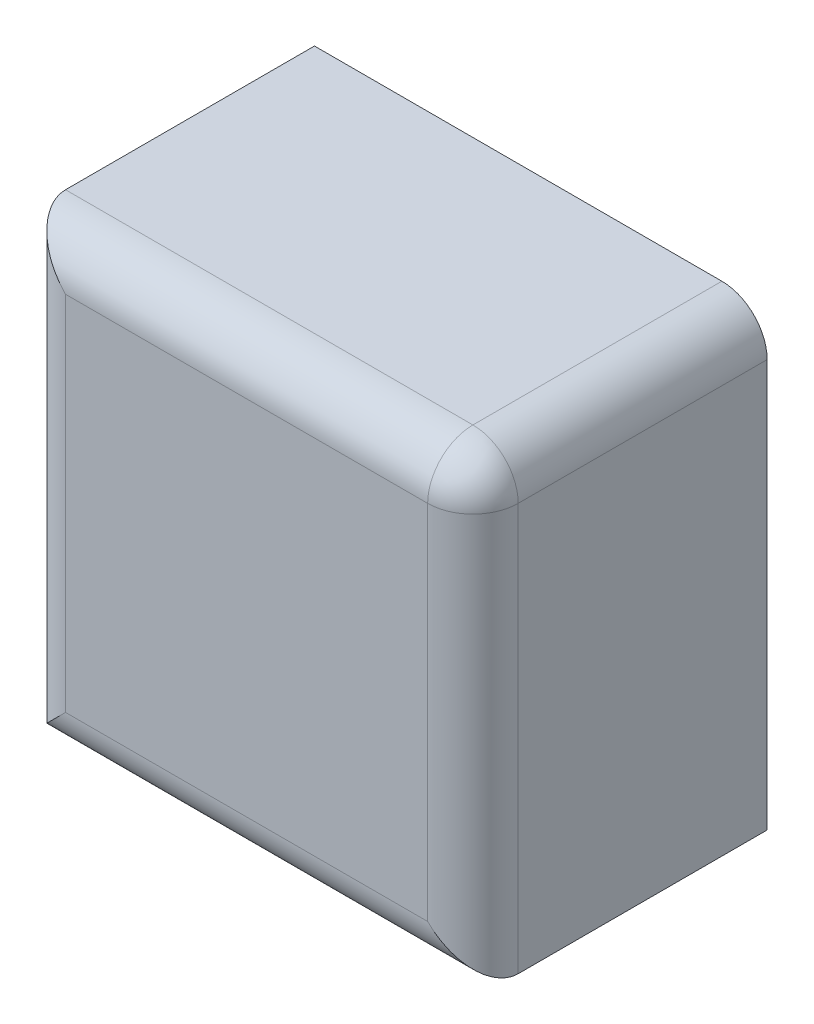
ISO-10303-21;
HEADER;
FILE_DESCRIPTION(('STEP AP214'),'2;1');
FILE_NAME('part.step','',(''),(''),'','','');
FILE_SCHEMA(('AUTOMOTIVE_DESIGN { 1 0 10303 214 1 1 1 1 }'));
ENDSEC;
DATA;
#1=APPLICATION_CONTEXT('core data for automotive mechanical design processes');
#2=APPLICATION_PROTOCOL_DEFINITION('international standard','automotive_design',2000,#1);
#3=PRODUCT_CONTEXT('',#1,'mechanical');
#4=PRODUCT('Part','Part','',(#3));
#5=PRODUCT_RELATED_PRODUCT_CATEGORY('part','',(#4));
#6=PRODUCT_DEFINITION_FORMATION('','',#4);
#7=PRODUCT_DEFINITION_CONTEXT('part definition',#1,'design');
#8=PRODUCT_DEFINITION('design','',#6,#7);
#9=PRODUCT_DEFINITION_SHAPE('','',#8);
#10=(LENGTH_UNIT() NAMED_UNIT(*) SI_UNIT(.MILLI.,.METRE.));
#11=(NAMED_UNIT(*) PLANE_ANGLE_UNIT() SI_UNIT($,.RADIAN.));
#12=(NAMED_UNIT(*) SI_UNIT($,.STERADIAN.) SOLID_ANGLE_UNIT());
#13=UNCERTAINTY_MEASURE_WITH_UNIT(LENGTH_MEASURE(1.E-05),#10,'distance_accuracy_value','');
#14=(GEOMETRIC_REPRESENTATION_CONTEXT(3) GLOBAL_UNCERTAINTY_ASSIGNED_CONTEXT((#13)) GLOBAL_UNIT_ASSIGNED_CONTEXT((#10,
#11,#12)) REPRESENTATION_CONTEXT('',''));
#15=CARTESIAN_POINT('',(0.,0.,0.));
#16=DIRECTION('',(0.,0.,1.));
#17=DIRECTION('',(1.,0.,0.));
#18=AXIS2_PLACEMENT_3D('',#15,#16,#17);
#19=CARTESIAN_POINT('',(0.,0.,6.5));
#20=DIRECTION('',(1.,0.,0.));
#21=DIRECTION('',(0.,0.,-1.));
#22=AXIS2_PLACEMENT_3D('',#19,#20,#21);
#23=PLANE('',#22);
#24=DIRECTION('',(0.,0.,-1.));
#25=VECTOR('',#24,1.);
#26=CARTESIAN_POINT('',(0.,0.,6.5));
#27=LINE('',#26,#25);
#28=CARTESIAN_POINT('',(0.,0.,5.5));
#29=VERTEX_POINT('',#28);
#30=CARTESIAN_POINT('',(0.,0.,0.));
#31=VERTEX_POINT('',#30);
#32=EDGE_CURVE('E128',#29,#31,#27,.T.);
#33=ORIENTED_EDGE('',*,*,#32,.F.);
#34=DIRECTION('',(0.,-1.,0.));
#35=VECTOR('',#34,1.);
#36=CARTESIAN_POINT('',(0.,0.,5.5));
#37=LINE('',#36,#35);
#38=CARTESIAN_POINT('',(0.,10.,5.5));
#39=VERTEX_POINT('',#38);
#40=EDGE_CURVE('E41',#29,#39,#37,.F.);
#41=ORIENTED_EDGE('',*,*,#40,.T.);
#42=DIRECTION('',(0.,0.,-1.));
#43=VECTOR('',#42,1.);
#44=CARTESIAN_POINT('',(0.,10.,6.5));
#45=LINE('',#44,#43);
#46=CARTESIAN_POINT('',(0.,10.,0.));
#47=VERTEX_POINT('',#46);
#48=EDGE_CURVE('E124',#39,#47,#45,.T.);
#49=ORIENTED_EDGE('',*,*,#48,.T.);
#50=DIRECTION('',(0.,-1.,0.));
#51=VECTOR('',#50,1.);
#52=CARTESIAN_POINT('',(0.,0.,0.));
#53=LINE('',#52,#51);
#54=EDGE_CURVE('E113',#47,#31,#53,.T.);
#55=ORIENTED_EDGE('',*,*,#54,.T.);
#56=EDGE_LOOP('',(#33,#41,#49,#55));
#57=FACE_BOUND('',#56,.T.);
#58=ADVANCED_FACE('F32',(#57),#23,.F.);
#59=CARTESIAN_POINT('',(0.,0.,6.5));
#60=DIRECTION('',(0.,1.,0.));
#61=DIRECTION('',(0.,0.,1.));
#62=AXIS2_PLACEMENT_3D('',#59,#60,#61);
#63=PLANE('',#62);
#64=DIRECTION('',(0.,0.,-1.));
#65=VECTOR('',#64,1.);
#66=CARTESIAN_POINT('',(10.,0.,6.5));
#67=LINE('',#66,#65);
#68=CARTESIAN_POINT('',(10.,0.,5.5));
#69=VERTEX_POINT('',#68);
#70=CARTESIAN_POINT('',(10.,0.,0.));
#71=VERTEX_POINT('',#70);
#72=EDGE_CURVE('E126',#69,#71,#67,.T.);
#73=ORIENTED_EDGE('',*,*,#72,.F.);
#74=DIRECTION('',(1.,0.,0.));
#75=VECTOR('',#74,1.);
#76=CARTESIAN_POINT('',(0.,0.,5.5));
#77=LINE('',#76,#75);
#78=EDGE_CURVE('E49',#69,#29,#77,.F.);
#79=ORIENTED_EDGE('',*,*,#78,.T.);
#80=ORIENTED_EDGE('',*,*,#32,.T.);
#81=DIRECTION('',(1.,0.,0.));
#82=VECTOR('',#81,1.);
#83=CARTESIAN_POINT('',(0.,0.,0.));
#84=LINE('',#83,#82);
#85=EDGE_CURVE('E116',#31,#71,#84,.T.);
#86=ORIENTED_EDGE('',*,*,#85,.T.);
#87=EDGE_LOOP('',(#73,#79,#80,#86));
#88=FACE_BOUND('',#87,.T.);
#89=ADVANCED_FACE('F197',(#88),#63,.F.);
#90=CARTESIAN_POINT('',(10.,0.,6.5));
#91=DIRECTION('',(-1.,0.,0.));
#92=DIRECTION('',(0.,0.,1.));
#93=AXIS2_PLACEMENT_3D('',#90,#91,#92);
#94=PLANE('',#93);
#95=DIRECTION('',(0.,0.,-1.));
#96=VECTOR('',#95,1.);
#97=CARTESIAN_POINT('',(10.,9.,6.5));
#98=LINE('',#97,#96);
#99=CARTESIAN_POINT('',(10.,9.,0.));
#100=VERTEX_POINT('',#99);
#101=CARTESIAN_POINT('',(10.,9.,5.5));
#102=VERTEX_POINT('',#101);
#103=EDGE_CURVE('E57',#100,#102,#98,.F.);
#104=ORIENTED_EDGE('',*,*,#103,.T.);
#105=DIRECTION('',(0.,1.,0.));
#106=VECTOR('',#105,1.);
#107=CARTESIAN_POINT('',(10.,0.,5.5));
#108=LINE('',#107,#106);
#109=EDGE_CURVE('E145',#102,#69,#108,.F.);
#110=ORIENTED_EDGE('',*,*,#109,.T.);
#111=ORIENTED_EDGE('',*,*,#72,.T.);
#112=DIRECTION('',(0.,1.,0.));
#113=VECTOR('',#112,1.);
#114=CARTESIAN_POINT('',(10.,0.,0.));
#115=LINE('',#114,#113);
#116=EDGE_CURVE('E119',#71,#100,#115,.T.);
#117=ORIENTED_EDGE('',*,*,#116,.T.);
#118=EDGE_LOOP('',(#104,#110,#111,#117));
#119=FACE_BOUND('',#118,.T.);
#120=ADVANCED_FACE('F202',(#119),#94,.F.);
#121=CARTESIAN_POINT('',(0.,10.,6.5));
#122=DIRECTION('',(0.,-1.,0.));
#123=DIRECTION('',(0.,0.,-1.));
#124=AXIS2_PLACEMENT_3D('',#121,#122,#123);
#125=PLANE('',#124);
#126=ORIENTED_EDGE('',*,*,#48,.F.);
#127=DIRECTION('',(-1.,0.,0.));
#128=VECTOR('',#127,1.);
#129=CARTESIAN_POINT('',(0.,10.,5.5));
#130=LINE('',#129,#128);
#131=CARTESIAN_POINT('',(9.,10.,5.5));
#132=VERTEX_POINT('',#131);
#133=EDGE_CURVE('E141',#39,#132,#130,.F.);
#134=ORIENTED_EDGE('',*,*,#133,.T.);
#135=DIRECTION('',(0.,0.,-1.));
#136=VECTOR('',#135,1.);
#137=CARTESIAN_POINT('',(9.,10.,6.5));
#138=LINE('',#137,#136);
#139=CARTESIAN_POINT('',(9.,10.,0.));
#140=VERTEX_POINT('',#139);
#141=EDGE_CURVE('E139',#132,#140,#138,.T.);
#142=ORIENTED_EDGE('',*,*,#141,.T.);
#143=DIRECTION('',(-1.,0.,0.));
#144=VECTOR('',#143,1.);
#145=CARTESIAN_POINT('',(0.,10.,0.));
#146=LINE('',#145,#144);
#147=EDGE_CURVE('E121',#140,#47,#146,.T.);
#148=ORIENTED_EDGE('',*,*,#147,.T.);
#149=EDGE_LOOP('',(#126,#134,#142,#148));
#150=FACE_BOUND('',#149,.T.);
#151=ADVANCED_FACE('F183',(#150),#125,.F.);
#152=CARTESIAN_POINT('',(0.,0.,6.5));
#153=DIRECTION('',(0.,0.,-1.));
#154=DIRECTION('',(-1.,0.,0.));
#155=AXIS2_PLACEMENT_3D('',#152,#153,#154);
#156=PLANE('',#155);
#157=DIRECTION('',(0.,1.,0.));
#158=VECTOR('',#157,1.);
#159=CARTESIAN_POINT('',(9.,0.,6.5));
#160=LINE('',#159,#158);
#161=CARTESIAN_POINT('',(9.,1.,6.5));
#162=VERTEX_POINT('',#161);
#163=CARTESIAN_POINT('',(9.,9.,6.5));
#164=VERTEX_POINT('',#163);
#165=EDGE_CURVE('E134',#162,#164,#160,.T.);
#166=ORIENTED_EDGE('',*,*,#165,.T.);
#167=DIRECTION('',(-1.,0.,0.));
#168=VECTOR('',#167,1.);
#169=CARTESIAN_POINT('',(0.,9.,6.5));
#170=LINE('',#169,#168);
#171=CARTESIAN_POINT('',(1.,9.,6.5));
#172=VERTEX_POINT('',#171);
#173=EDGE_CURVE('E136',#164,#172,#170,.T.);
#174=ORIENTED_EDGE('',*,*,#173,.T.);
#175=DIRECTION('',(0.,-1.,0.));
#176=VECTOR('',#175,1.);
#177=CARTESIAN_POINT('',(1.,0.,6.5));
#178=LINE('',#177,#176);
#179=CARTESIAN_POINT('',(1.,1.,6.5));
#180=VERTEX_POINT('',#179);
#181=EDGE_CURVE('E130',#172,#180,#178,.T.);
#182=ORIENTED_EDGE('',*,*,#181,.T.);
#183=DIRECTION('',(1.,0.,0.));
#184=VECTOR('',#183,1.);
#185=CARTESIAN_POINT('',(0.,1.,6.5));
#186=LINE('',#185,#184);
#187=EDGE_CURVE('E132',#180,#162,#186,.T.);
#188=ORIENTED_EDGE('',*,*,#187,.T.);
#189=EDGE_LOOP('',(#166,#174,#182,#188));
#190=FACE_BOUND('',#189,.T.);
#191=ADVANCED_FACE('F172',(#190),#156,.F.);
#192=CARTESIAN_POINT('',(0.,0.,0.));
#193=DIRECTION('',(0.,0.,-1.));
#194=DIRECTION('',(-1.,0.,0.));
#195=AXIS2_PLACEMENT_3D('',#192,#193,#194);
#196=PLANE('',#195);
#197=CARTESIAN_POINT('',(3.5,3.5,0.));
#198=DIRECTION('',(0.,0.,-1.));
#199=DIRECTION('',(-1.,0.,0.));
#200=AXIS2_PLACEMENT_3D('',#197,#198,#199);
#201=CIRCLE('',#200,1.19999999999996);
#202=CARTESIAN_POINT('',(2.30000000000004,3.5,0.));
#203=VERTEX_POINT('',#202);
#204=EDGE_CURVE('E106',#203,#203,#201,.T.);
#205=ORIENTED_EDGE('',*,*,#204,.F.);
#206=EDGE_LOOP('',(#205));
#207=FACE_BOUND('',#206,.T.);
#208=ORIENTED_EDGE('',*,*,#147,.F.);
#209=CARTESIAN_POINT('',(9.,9.,0.));
#210=DIRECTION('',(0.,0.,-1.));
#211=DIRECTION('',(-1.,0.,0.));
#212=AXIS2_PLACEMENT_3D('',#209,#210,#211);
#213=CIRCLE('',#212,1.);
#214=EDGE_CURVE('E11',#140,#100,#213,.T.);
#215=ORIENTED_EDGE('',*,*,#214,.T.);
#216=ORIENTED_EDGE('',*,*,#116,.F.);
#217=ORIENTED_EDGE('',*,*,#85,.F.);
#218=ORIENTED_EDGE('',*,*,#54,.F.);
#219=EDGE_LOOP('',(#208,#215,#216,#217,#218));
#220=FACE_BOUND('',#219,.T.);
#221=ADVANCED_FACE('F255',(#207,#220),#196,.T.);
#222=CARTESIAN_POINT('',(9.,9.,6.5));
#223=DIRECTION('',(0.,0.,-1.));
#224=DIRECTION('',(-1.,0.,0.));
#225=AXIS2_PLACEMENT_3D('',#222,#223,#224);
#226=CYLINDRICAL_SURFACE('',#225,1.);
#227=ORIENTED_EDGE('',*,*,#214,.F.);
#228=ORIENTED_EDGE('',*,*,#141,.F.);
#229=CARTESIAN_POINT('',(9.,9.,5.5));
#230=DIRECTION('',(0.,0.,1.));
#231=DIRECTION('',(1.,0.,0.));
#232=AXIS2_PLACEMENT_3D('',#229,#230,#231);
#233=CIRCLE('',#232,1.);
#234=EDGE_CURVE('E155',#102,#132,#233,.T.);
#235=ORIENTED_EDGE('',*,*,#234,.F.);
#236=ORIENTED_EDGE('',*,*,#103,.F.);
#237=EDGE_LOOP('',(#227,#228,#235,#236));
#238=FACE_BOUND('',#237,.T.);
#239=ADVANCED_FACE('F34',(#238),#226,.T.);
#240=CARTESIAN_POINT('',(9.,0.,5.5));
#241=DIRECTION('',(0.,1.,0.));
#242=DIRECTION('',(0.,0.,1.));
#243=AXIS2_PLACEMENT_3D('',#240,#241,#242);
#244=CYLINDRICAL_SURFACE('',#243,1.);
#245=CARTESIAN_POINT('',(9.,9.,5.5));
#246=DIRECTION('',(0.,1.,0.));
#247=DIRECTION('',(0.,0.,1.));
#248=AXIS2_PLACEMENT_3D('',#245,#246,#247);
#249=CIRCLE('',#248,1.);
#250=EDGE_CURVE('E153',#164,#102,#249,.T.);
#251=ORIENTED_EDGE('',*,*,#250,.F.);
#252=ORIENTED_EDGE('',*,*,#165,.F.);
#253=CARTESIAN_POINT('',(9.,1.,5.5));
#254=DIRECTION('',(0.707106781186547,0.707106781186547,0.));
#255=DIRECTION('',(0.707106781186547,-0.707106781186547,0.));
#256=AXIS2_PLACEMENT_3D('',#253,#254,#255);
#257=ELLIPSE('',#256,1.41421356237309,1.);
#258=EDGE_CURVE('E36',#69,#162,#257,.F.);
#259=ORIENTED_EDGE('',*,*,#258,.F.);
#260=ORIENTED_EDGE('',*,*,#109,.F.);
#261=EDGE_LOOP('',(#251,#252,#259,#260));
#262=FACE_BOUND('',#261,.T.);
#263=ADVANCED_FACE('F170',(#262),#244,.T.);
#264=CARTESIAN_POINT('',(0.,1.,5.5));
#265=DIRECTION('',(1.,0.,0.));
#266=DIRECTION('',(0.,0.,-1.));
#267=AXIS2_PLACEMENT_3D('',#264,#265,#266);
#268=CYLINDRICAL_SURFACE('',#267,1.);
#269=ORIENTED_EDGE('',*,*,#258,.T.);
#270=ORIENTED_EDGE('',*,*,#187,.F.);
#271=CARTESIAN_POINT('',(1.,1.,5.5));
#272=DIRECTION('',(0.707106781186547,-0.707106781186547,0.));
#273=DIRECTION('',(-0.707106781186547,-0.707106781186547,0.));
#274=AXIS2_PLACEMENT_3D('',#271,#272,#273);
#275=ELLIPSE('',#274,1.41421356237309,1.);
#276=EDGE_CURVE('E150',#29,#180,#275,.F.);
#277=ORIENTED_EDGE('',*,*,#276,.F.);
#278=ORIENTED_EDGE('',*,*,#78,.F.);
#279=EDGE_LOOP('',(#269,#270,#277,#278));
#280=FACE_BOUND('',#279,.T.);
#281=ADVANCED_FACE('F165',(#280),#268,.T.);
#282=CARTESIAN_POINT('',(9.,9.,5.5));
#283=DIRECTION('',(0.,0.,1.));
#284=DIRECTION('',(1.,0.,0.));
#285=AXIS2_PLACEMENT_3D('',#282,#283,#284);
#286=SPHERICAL_SURFACE('',#285,1.);
#287=ORIENTED_EDGE('',*,*,#250,.T.);
#288=ORIENTED_EDGE('',*,*,#234,.T.);
#289=CARTESIAN_POINT('',(9.,9.,5.5));
#290=DIRECTION('',(1.,0.,0.));
#291=DIRECTION('',(0.,0.,-1.));
#292=AXIS2_PLACEMENT_3D('',#289,#290,#291);
#293=CIRCLE('',#292,1.);
#294=EDGE_CURVE('E108',#164,#132,#293,.F.);
#295=ORIENTED_EDGE('',*,*,#294,.F.);
#296=EDGE_LOOP('',(#287,#288,#295));
#297=FACE_BOUND('',#296,.T.);
#298=ADVANCED_FACE('F187',(#297),#286,.T.);
#299=CARTESIAN_POINT('',(1.,0.,5.5));
#300=DIRECTION('',(0.,-1.,0.));
#301=DIRECTION('',(0.,0.,-1.));
#302=AXIS2_PLACEMENT_3D('',#299,#300,#301);
#303=CYLINDRICAL_SURFACE('',#302,1.);
#304=ORIENTED_EDGE('',*,*,#276,.T.);
#305=ORIENTED_EDGE('',*,*,#181,.F.);
#306=CARTESIAN_POINT('',(1.,9.,5.5));
#307=DIRECTION('',(-0.707106781186547,-0.707106781186547,0.));
#308=DIRECTION('',(0.707106781186547,-0.707106781186547,0.));
#309=AXIS2_PLACEMENT_3D('',#306,#307,#308);
#310=ELLIPSE('',#309,1.41421356237309,1.);
#311=EDGE_CURVE('E105',#39,#172,#310,.F.);
#312=ORIENTED_EDGE('',*,*,#311,.F.);
#313=ORIENTED_EDGE('',*,*,#40,.F.);
#314=EDGE_LOOP('',(#304,#305,#312,#313));
#315=FACE_BOUND('',#314,.T.);
#316=ADVANCED_FACE('F177',(#315),#303,.T.);
#317=CARTESIAN_POINT('',(0.,9.,5.5));
#318=DIRECTION('',(-1.,0.,0.));
#319=DIRECTION('',(0.,0.,1.));
#320=AXIS2_PLACEMENT_3D('',#317,#318,#319);
#321=CYLINDRICAL_SURFACE('',#320,1.);
#322=ORIENTED_EDGE('',*,*,#294,.T.);
#323=ORIENTED_EDGE('',*,*,#133,.F.);
#324=ORIENTED_EDGE('',*,*,#311,.T.);
#325=ORIENTED_EDGE('',*,*,#173,.F.);
#326=EDGE_LOOP('',(#322,#323,#324,#325));
#327=FACE_BOUND('',#326,.T.);
#328=ADVANCED_FACE('F99',(#327),#321,.T.);
#329=CARTESIAN_POINT('',(3.5,3.5,4.));
#330=DIRECTION('',(0.,0.,-1.));
#331=DIRECTION('',(-1.,0.,0.));
#332=AXIS2_PLACEMENT_3D('',#329,#330,#331);
#333=CONICAL_SURFACE('',#332,1.2,1.02974425867665);
#334=CARTESIAN_POINT('',(3.5,3.5,4.72103274283307));
#335=VERTEX_POINT('',#334);
#336=VERTEX_LOOP('',#335);
#337=FACE_BOUND('',#336,.T.);
#338=CARTESIAN_POINT('',(3.5,3.5,4.));
#339=DIRECTION('',(0.,0.,-1.));
#340=DIRECTION('',(-1.,0.,0.));
#341=AXIS2_PLACEMENT_3D('',#338,#339,#340);
#342=CIRCLE('',#341,1.2);
#343=CARTESIAN_POINT('',(2.3,3.5,4.));
#344=VERTEX_POINT('',#343);
#345=EDGE_CURVE('E103',#344,#344,#342,.T.);
#346=ORIENTED_EDGE('',*,*,#345,.T.);
#347=EDGE_LOOP('',(#346));
#348=FACE_BOUND('',#347,.T.);
#349=ADVANCED_FACE('F95',(#337,#348),#333,.F.);
#350=CARTESIAN_POINT('',(3.5,3.5,0.));
#351=DIRECTION('',(0.,0.,-1.));
#352=DIRECTION('',(-1.,0.,0.));
#353=AXIS2_PLACEMENT_3D('',#350,#351,#352);
#354=CYLINDRICAL_SURFACE('',#353,1.19999999999998);
#355=ORIENTED_EDGE('',*,*,#345,.F.);
#356=EDGE_LOOP('',(#355));
#357=FACE_BOUND('',#356,.T.);
#358=ORIENTED_EDGE('',*,*,#204,.T.);
#359=EDGE_LOOP('',(#358));
#360=FACE_BOUND('',#359,.T.);
#361=ADVANCED_FACE('F98',(#357,#360),#354,.F.);
#362=CLOSED_SHELL('',(#58,#89,#120,#151,#191,#221,#239,#263,#281,#298,#316,#328,#349,#361));
#363=MANIFOLD_SOLID_BREP('B2',#362);
#364=ADVANCED_BREP_SHAPE_REPRESENTATION('',(#18,#363),#14);
#365=SHAPE_DEFINITION_REPRESENTATION(#9,#364);
ENDSEC;
END-ISO-10303-21;
